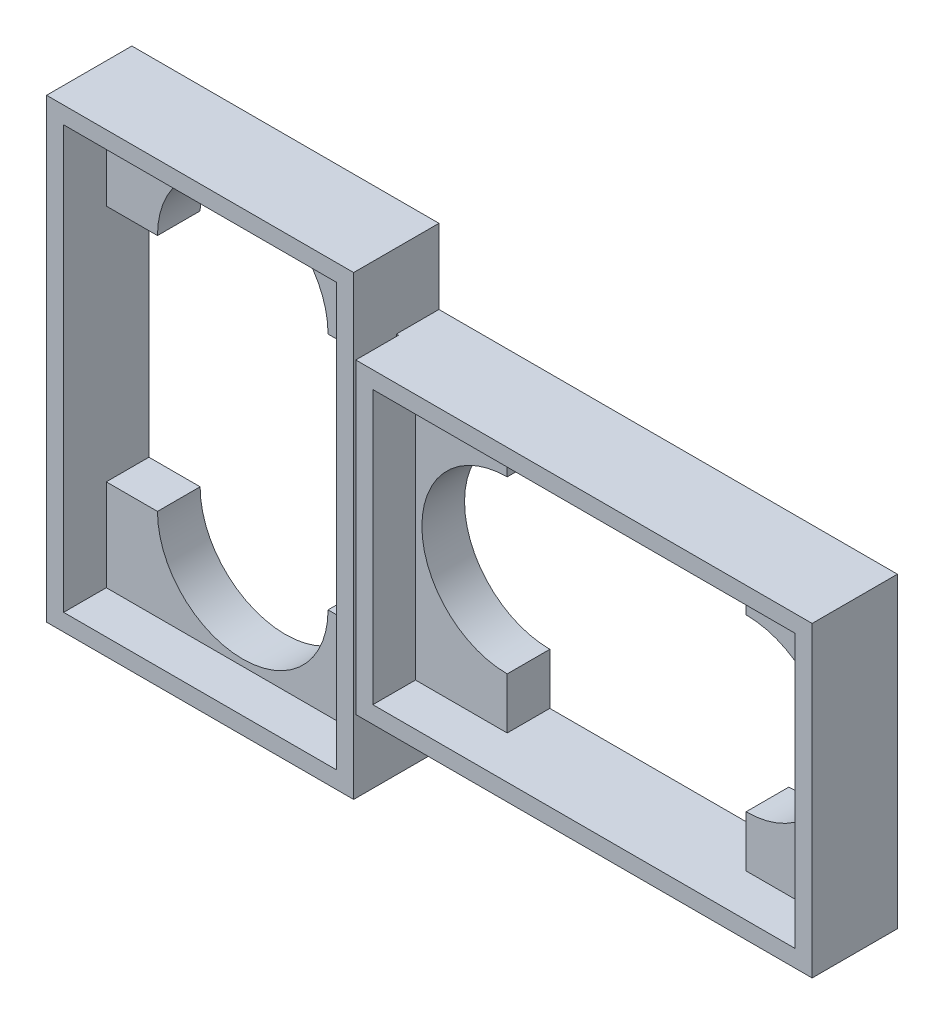
ISO-10303-21;
HEADER;
FILE_DESCRIPTION(('STEP AP214'),'2;1');
FILE_NAME('part.step','',(''),(''),'','','');
FILE_SCHEMA(('AUTOMOTIVE_DESIGN { 1 0 10303 214 1 1 1 1 }'));
ENDSEC;
DATA;
#1=APPLICATION_CONTEXT('core data for automotive mechanical design processes');
#2=APPLICATION_PROTOCOL_DEFINITION('international standard','automotive_design',2000,#1);
#3=PRODUCT_CONTEXT('',#1,'mechanical');
#4=PRODUCT('Part','Part','',(#3));
#5=PRODUCT_RELATED_PRODUCT_CATEGORY('part','',(#4));
#6=PRODUCT_DEFINITION_FORMATION('','',#4);
#7=PRODUCT_DEFINITION_CONTEXT('part definition',#1,'design');
#8=PRODUCT_DEFINITION('design','',#6,#7);
#9=PRODUCT_DEFINITION_SHAPE('','',#8);
#10=(LENGTH_UNIT() NAMED_UNIT(*) SI_UNIT(.MILLI.,.METRE.));
#11=(NAMED_UNIT(*) PLANE_ANGLE_UNIT() SI_UNIT($,.RADIAN.));
#12=(NAMED_UNIT(*) SI_UNIT($,.STERADIAN.) SOLID_ANGLE_UNIT());
#13=UNCERTAINTY_MEASURE_WITH_UNIT(LENGTH_MEASURE(1.E-05),#10,'distance_accuracy_value','');
#14=(GEOMETRIC_REPRESENTATION_CONTEXT(3) GLOBAL_UNCERTAINTY_ASSIGNED_CONTEXT((#13)) GLOBAL_UNIT_ASSIGNED_CONTEXT((#10,
#11,#12)) REPRESENTATION_CONTEXT('',''));
#15=CARTESIAN_POINT('',(0.,0.,0.));
#16=DIRECTION('',(0.,0.,1.));
#17=DIRECTION('',(1.,0.,0.));
#18=AXIS2_PLACEMENT_3D('',#15,#16,#17);
#19=CARTESIAN_POINT('',(0.,0.,5.));
#20=DIRECTION('',(0.,0.,-1.));
#21=DIRECTION('',(-1.,0.,0.));
#22=AXIS2_PLACEMENT_3D('',#19,#20,#21);
#23=PLANE('',#22);
#24=DIRECTION('',(0.,1.,0.));
#25=VECTOR('',#24,1.);
#26=CARTESIAN_POINT('',(-7.,0.,5.));
#27=LINE('',#26,#25);
#28=CARTESIAN_POINT('',(-7.,-15.1889938763432,5.));
#29=VERTEX_POINT('',#28);
#30=CARTESIAN_POINT('',(-7.,18.,5.));
#31=VERTEX_POINT('',#30);
#32=EDGE_CURVE('E636',#29,#31,#27,.T.);
#33=ORIENTED_EDGE('',*,*,#32,.F.);
#34=DIRECTION('',(-1.,0.,0.));
#35=VECTOR('',#34,1.);
#36=CARTESIAN_POINT('',(0.,-15.1889938763432,5.));
#37=LINE('',#36,#35);
#38=CARTESIAN_POINT('',(-6.75000000000001,-15.1889938763432,5.));
#39=VERTEX_POINT('',#38);
#40=EDGE_CURVE('E691',#39,#29,#37,.T.);
#41=ORIENTED_EDGE('',*,*,#40,.F.);
#42=DIRECTION('',(0.,1.,0.));
#43=VECTOR('',#42,1.);
#44=CARTESIAN_POINT('',(-6.75000000000001,0.,5.));
#45=LINE('',#44,#43);
#46=CARTESIAN_POINT('',(-6.75000000000001,18.,5.));
#47=VERTEX_POINT('',#46);
#48=EDGE_CURVE('E565',#39,#47,#45,.T.);
#49=ORIENTED_EDGE('',*,*,#48,.T.);
#50=DIRECTION('',(1.,0.,0.));
#51=VECTOR('',#50,1.);
#52=CARTESIAN_POINT('',(0.,18.,5.));
#53=LINE('',#52,#51);
#54=EDGE_CURVE('E708',#31,#47,#53,.T.);
#55=ORIENTED_EDGE('',*,*,#54,.F.);
#56=EDGE_LOOP('',(#33,#41,#49,#55));
#57=FACE_BOUND('',#56,.T.);
#58=ADVANCED_FACE('F87',(#57),#23,.F.);
#59=CARTESIAN_POINT('',(-25.,-14.,5.));
#60=DIRECTION('',(0.,0.,1.));
#61=DIRECTION('',(1.,0.,0.));
#62=AXIS2_PLACEMENT_3D('',#59,#60,#61);
#63=CIRCLE('',#62,10.);
#64=CARTESIAN_POINT('',(-15.,-14.,5.));
#65=VERTEX_POINT('',#64);
#66=CARTESIAN_POINT('',(-35.,-14.,5.));
#67=VERTEX_POINT('',#66);
#68=EDGE_CURVE('E487',#65,#67,#63,.F.);
#69=ORIENTED_EDGE('',*,*,#68,.T.);
#70=DIRECTION('',(1.,0.,0.));
#71=VECTOR('',#70,1.);
#72=CARTESIAN_POINT('',(-35.,-14.,5.));
#73=LINE('',#72,#71);
#74=CARTESIAN_POINT('',(-41.,-14.,5.));
#75=VERTEX_POINT('',#74);
#76=EDGE_CURVE('E402',#75,#67,#73,.T.);
#77=ORIENTED_EDGE('',*,*,#76,.F.);
#78=DIRECTION('',(0.,1.,0.));
#79=VECTOR('',#78,1.);
#80=CARTESIAN_POINT('',(-41.,0.,5.));
#81=LINE('',#80,#79);
#82=CARTESIAN_POINT('',(-41.,-24.75,5.));
#83=VERTEX_POINT('',#82);
#84=EDGE_CURVE('E620',#83,#75,#81,.T.);
#85=ORIENTED_EDGE('',*,*,#84,.F.);
#86=DIRECTION('',(-1.,0.,0.));
#87=VECTOR('',#86,1.);
#88=CARTESIAN_POINT('',(0.,-24.75,5.));
#89=LINE('',#88,#87);
#90=CARTESIAN_POINT('',(-9.,-24.75,5.));
#91=VERTEX_POINT('',#90);
#92=EDGE_CURVE('E592',#91,#83,#89,.T.);
#93=ORIENTED_EDGE('',*,*,#92,.F.);
#94=DIRECTION('',(0.,1.,0.));
#95=VECTOR('',#94,1.);
#96=CARTESIAN_POINT('',(-9.,0.,5.));
#97=LINE('',#96,#95);
#98=CARTESIAN_POINT('',(-9.,-14.,5.));
#99=VERTEX_POINT('',#98);
#100=EDGE_CURVE('E604',#91,#99,#97,.T.);
#101=ORIENTED_EDGE('',*,*,#100,.T.);
#102=DIRECTION('',(1.,0.,0.));
#103=VECTOR('',#102,1.);
#104=CARTESIAN_POINT('',(-15.,-14.,5.));
#105=LINE('',#104,#103);
#106=EDGE_CURVE('E421',#65,#99,#105,.T.);
#107=ORIENTED_EDGE('',*,*,#106,.F.);
#108=EDGE_LOOP('',(#69,#77,#85,#93,#101,#107));
#109=FACE_BOUND('',#108,.T.);
#110=ADVANCED_FACE('F741',(#109),#23,.F.);
#111=CARTESIAN_POINT('',(5.99999999999999,0.,5.));
#112=DIRECTION('',(0.,0.,1.));
#113=DIRECTION('',(1.,0.,0.));
#114=AXIS2_PLACEMENT_3D('',#111,#112,#113);
#115=CIRCLE('',#114,10.);
#116=CARTESIAN_POINT('',(6.00000000000009,-10.,5.));
#117=VERTEX_POINT('',#116);
#118=CARTESIAN_POINT('',(5.99999999999995,9.99999999999999,5.));
#119=VERTEX_POINT('',#118);
#120=EDGE_CURVE('E473',#117,#119,#115,.F.);
#121=ORIENTED_EDGE('',*,*,#120,.T.);
#122=DIRECTION('',(0.,-1.,0.));
#123=VECTOR('',#122,1.);
#124=CARTESIAN_POINT('',(5.99999999999995,9.99999999999999,5.));
#125=LINE('',#124,#123);
#126=CARTESIAN_POINT('',(5.99999999999999,16.,5.));
#127=VERTEX_POINT('',#126);
#128=EDGE_CURVE('E394',#127,#119,#125,.T.);
#129=ORIENTED_EDGE('',*,*,#128,.F.);
#130=DIRECTION('',(-1.,0.,0.));
#131=VECTOR('',#130,1.);
#132=CARTESIAN_POINT('',(0.,16.,5.));
#133=LINE('',#132,#131);
#134=CARTESIAN_POINT('',(-4.75000000000001,16.,5.));
#135=VERTEX_POINT('',#134);
#136=EDGE_CURVE('E548',#127,#135,#133,.T.);
#137=ORIENTED_EDGE('',*,*,#136,.T.);
#138=DIRECTION('',(0.,1.,0.));
#139=VECTOR('',#138,1.);
#140=CARTESIAN_POINT('',(-4.75000000000001,0.,5.));
#141=LINE('',#140,#139);
#142=CARTESIAN_POINT('',(-4.75000000000001,-16.,5.));
#143=VERTEX_POINT('',#142);
#144=EDGE_CURVE('E517',#143,#135,#141,.T.);
#145=ORIENTED_EDGE('',*,*,#144,.F.);
#146=DIRECTION('',(-1.,0.,0.));
#147=VECTOR('',#146,1.);
#148=CARTESIAN_POINT('',(0.,-16.,5.));
#149=LINE('',#148,#147);
#150=CARTESIAN_POINT('',(5.99999999999999,-16.,5.));
#151=VERTEX_POINT('',#150);
#152=EDGE_CURVE('E557',#151,#143,#149,.T.);
#153=ORIENTED_EDGE('',*,*,#152,.F.);
#154=DIRECTION('',(0.,-1.,0.));
#155=VECTOR('',#154,1.);
#156=CARTESIAN_POINT('',(6.00000000000009,-10.,5.));
#157=LINE('',#156,#155);
#158=EDGE_CURVE('E371',#117,#151,#157,.T.);
#159=ORIENTED_EDGE('',*,*,#158,.F.);
#160=EDGE_LOOP('',(#121,#129,#137,#145,#153,#159));
#161=FACE_BOUND('',#160,.T.);
#162=ADVANCED_FACE('F746',(#161),#23,.F.);
#163=CARTESIAN_POINT('',(0.,0.,0.));
#164=DIRECTION('',(0.,0.,-1.));
#165=DIRECTION('',(-1.,0.,0.));
#166=AXIS2_PLACEMENT_3D('',#163,#164,#165);
#167=PLANE('',#166);
#168=DIRECTION('',(0.,1.,0.));
#169=VECTOR('',#168,1.);
#170=CARTESIAN_POINT('',(46.75,0.,0.));
#171=LINE('',#170,#169);
#172=CARTESIAN_POINT('',(46.75,-18.,0.));
#173=VERTEX_POINT('',#172);
#174=CARTESIAN_POINT('',(46.75,18.,0.));
#175=VERTEX_POINT('',#174);
#176=EDGE_CURVE('E320',#173,#175,#171,.T.);
#177=ORIENTED_EDGE('',*,*,#176,.F.);
#178=DIRECTION('',(1.,0.,0.));
#179=VECTOR('',#178,1.);
#180=CARTESIAN_POINT('',(0.,-18.,0.));
#181=LINE('',#180,#179);
#182=CARTESIAN_POINT('',(-6.75000000000001,-18.,0.));
#183=VERTEX_POINT('',#182);
#184=EDGE_CURVE('E335',#183,#173,#181,.T.);
#185=ORIENTED_EDGE('',*,*,#184,.F.);
#186=DIRECTION('',(0.,-1.,0.));
#187=VECTOR('',#186,1.);
#188=CARTESIAN_POINT('',(-6.75000000000001,0.,0.));
#189=LINE('',#188,#187);
#190=CARTESIAN_POINT('',(-6.75000000000001,-15.1889938763432,0.));
#191=VERTEX_POINT('',#190);
#192=EDGE_CURVE('E343',#191,#183,#189,.T.);
#193=ORIENTED_EDGE('',*,*,#192,.F.);
#194=DIRECTION('',(1.,0.,0.));
#195=VECTOR('',#194,1.);
#196=CARTESIAN_POINT('',(0.,-15.1889938763432,0.));
#197=LINE('',#196,#195);
#198=CARTESIAN_POINT('',(-7.,-15.1889938763432,0.));
#199=VERTEX_POINT('',#198);
#200=EDGE_CURVE('E346',#199,#191,#197,.T.);
#201=ORIENTED_EDGE('',*,*,#200,.F.);
#202=DIRECTION('',(0.,1.,0.));
#203=VECTOR('',#202,1.);
#204=CARTESIAN_POINT('',(-7.,0.,0.));
#205=LINE('',#204,#203);
#206=CARTESIAN_POINT('',(-7.,-26.75,0.));
#207=VERTEX_POINT('',#206);
#208=EDGE_CURVE('E352',#207,#199,#205,.T.);
#209=ORIENTED_EDGE('',*,*,#208,.F.);
#210=DIRECTION('',(1.,0.,0.));
#211=VECTOR('',#210,1.);
#212=CARTESIAN_POINT('',(0.,-26.75,0.));
#213=LINE('',#212,#211);
#214=CARTESIAN_POINT('',(-43.,-26.75,0.));
#215=VERTEX_POINT('',#214);
#216=EDGE_CURVE('E355',#215,#207,#213,.T.);
#217=ORIENTED_EDGE('',*,*,#216,.F.);
#218=DIRECTION('',(0.,-1.,0.));
#219=VECTOR('',#218,1.);
#220=CARTESIAN_POINT('',(-43.,0.,0.));
#221=LINE('',#220,#219);
#222=CARTESIAN_POINT('',(-43.,26.75,0.));
#223=VERTEX_POINT('',#222);
#224=EDGE_CURVE('E359',#223,#215,#221,.T.);
#225=ORIENTED_EDGE('',*,*,#224,.F.);
#226=DIRECTION('',(-1.,0.,0.));
#227=VECTOR('',#226,1.);
#228=CARTESIAN_POINT('',(0.,26.75,0.));
#229=LINE('',#228,#227);
#230=CARTESIAN_POINT('',(-7.,26.75,0.));
#231=VERTEX_POINT('',#230);
#232=EDGE_CURVE('E363',#231,#223,#229,.T.);
#233=ORIENTED_EDGE('',*,*,#232,.F.);
#234=DIRECTION('',(0.,1.,0.));
#235=VECTOR('',#234,1.);
#236=CARTESIAN_POINT('',(-7.,0.,0.));
#237=LINE('',#236,#235);
#238=CARTESIAN_POINT('',(-7.,18.,0.));
#239=VERTEX_POINT('',#238);
#240=EDGE_CURVE('E367',#239,#231,#237,.T.);
#241=ORIENTED_EDGE('',*,*,#240,.F.);
#242=DIRECTION('',(-1.,0.,0.));
#243=VECTOR('',#242,1.);
#244=CARTESIAN_POINT('',(0.,18.,0.));
#245=LINE('',#244,#243);
#246=EDGE_CURVE('E337',#175,#239,#245,.T.);
#247=ORIENTED_EDGE('',*,*,#246,.F.);
#248=EDGE_LOOP('',(#177,#185,#193,#201,#209,#217,#225,#233,#241,#247));
#249=FACE_BOUND('',#248,.T.);
#250=DIRECTION('',(1.,0.,0.));
#251=VECTOR('',#250,1.);
#252=CARTESIAN_POINT('',(-35.,-14.,0.));
#253=LINE('',#252,#251);
#254=CARTESIAN_POINT('',(-41.,-14.,0.));
#255=VERTEX_POINT('',#254);
#256=CARTESIAN_POINT('',(-35.,-14.,0.));
#257=VERTEX_POINT('',#256);
#258=EDGE_CURVE('E406',#255,#257,#253,.T.);
#259=ORIENTED_EDGE('',*,*,#258,.T.);
#260=CARTESIAN_POINT('',(-25.,-14.,0.));
#261=DIRECTION('',(0.,0.,1.));
#262=DIRECTION('',(1.,0.,0.));
#263=AXIS2_PLACEMENT_3D('',#260,#261,#262);
#264=CIRCLE('',#263,10.);
#265=CARTESIAN_POINT('',(-15.,-14.,0.));
#266=VERTEX_POINT('',#265);
#267=EDGE_CURVE('E498',#266,#257,#264,.F.);
#268=ORIENTED_EDGE('',*,*,#267,.F.);
#269=DIRECTION('',(1.,0.,0.));
#270=VECTOR('',#269,1.);
#271=CARTESIAN_POINT('',(-15.,-14.,0.));
#272=LINE('',#271,#270);
#273=CARTESIAN_POINT('',(-9.,-14.,0.));
#274=VERTEX_POINT('',#273);
#275=EDGE_CURVE('E113',#266,#274,#272,.T.);
#276=ORIENTED_EDGE('',*,*,#275,.T.);
#277=DIRECTION('',(0.,1.,0.));
#278=VECTOR('',#277,1.);
#279=CARTESIAN_POINT('',(-9.,14.,0.));
#280=LINE('',#279,#278);
#281=CARTESIAN_POINT('',(-9.,14.,0.));
#282=VERTEX_POINT('',#281);
#283=EDGE_CURVE('E447',#274,#282,#280,.T.);
#284=ORIENTED_EDGE('',*,*,#283,.T.);
#285=DIRECTION('',(-1.,0.,0.));
#286=VECTOR('',#285,1.);
#287=CARTESIAN_POINT('',(-15.,14.,0.));
#288=LINE('',#287,#286);
#289=CARTESIAN_POINT('',(-15.,14.,0.));
#290=VERTEX_POINT('',#289);
#291=EDGE_CURVE('E452',#282,#290,#288,.T.);
#292=ORIENTED_EDGE('',*,*,#291,.T.);
#293=CARTESIAN_POINT('',(-25.,14.,0.));
#294=DIRECTION('',(0.,0.,1.));
#295=DIRECTION('',(1.,0.,0.));
#296=AXIS2_PLACEMENT_3D('',#293,#294,#295);
#297=CIRCLE('',#296,10.);
#298=CARTESIAN_POINT('',(-35.,14.,0.));
#299=VERTEX_POINT('',#298);
#300=EDGE_CURVE('E502',#299,#290,#297,.F.);
#301=ORIENTED_EDGE('',*,*,#300,.F.);
#302=DIRECTION('',(-1.,0.,0.));
#303=VECTOR('',#302,1.);
#304=CARTESIAN_POINT('',(-35.,14.,0.));
#305=LINE('',#304,#303);
#306=CARTESIAN_POINT('',(-41.,14.,0.));
#307=VERTEX_POINT('',#306);
#308=EDGE_CURVE('E397',#299,#307,#305,.T.);
#309=ORIENTED_EDGE('',*,*,#308,.T.);
#310=DIRECTION('',(0.,-1.,0.));
#311=VECTOR('',#310,1.);
#312=CARTESIAN_POINT('',(-41.,14.,0.));
#313=LINE('',#312,#311);
#314=EDGE_CURVE('E401',#307,#255,#313,.T.);
#315=ORIENTED_EDGE('',*,*,#314,.T.);
#316=EDGE_LOOP('',(#259,#268,#276,#284,#292,#301,#309,#315));
#317=FACE_BOUND('',#316,.T.);
#318=DIRECTION('',(0.,-1.,0.));
#319=VECTOR('',#318,1.);
#320=CARTESIAN_POINT('',(5.99999999999995,9.99999999999999,0.));
#321=LINE('',#320,#319);
#322=CARTESIAN_POINT('',(5.99999999999999,16.,0.));
#323=VERTEX_POINT('',#322);
#324=CARTESIAN_POINT('',(5.99999999999995,9.99999999999999,0.));
#325=VERTEX_POINT('',#324);
#326=EDGE_CURVE('E424',#323,#325,#321,.T.);
#327=ORIENTED_EDGE('',*,*,#326,.T.);
#328=CARTESIAN_POINT('',(5.99999999999999,0.,0.));
#329=DIRECTION('',(0.,0.,1.));
#330=DIRECTION('',(1.,0.,0.));
#331=AXIS2_PLACEMENT_3D('',#328,#329,#330);
#332=CIRCLE('',#331,10.);
#333=CARTESIAN_POINT('',(6.00000000000009,-10.,0.));
#334=VERTEX_POINT('',#333);
#335=EDGE_CURVE('E472',#334,#325,#332,.F.);
#336=ORIENTED_EDGE('',*,*,#335,.F.);
#337=DIRECTION('',(0.,-1.,0.));
#338=VECTOR('',#337,1.);
#339=CARTESIAN_POINT('',(6.00000000000009,-10.,0.));
#340=LINE('',#339,#338);
#341=CARTESIAN_POINT('',(5.99999999999999,-16.,0.));
#342=VERTEX_POINT('',#341);
#343=EDGE_CURVE('E372',#334,#342,#340,.T.);
#344=ORIENTED_EDGE('',*,*,#343,.T.);
#345=DIRECTION('',(1.,0.,0.));
#346=VECTOR('',#345,1.);
#347=CARTESIAN_POINT('',(5.99999999999999,-16.,0.));
#348=LINE('',#347,#346);
#349=CARTESIAN_POINT('',(34.,-16.,0.));
#350=VERTEX_POINT('',#349);
#351=EDGE_CURVE('E376',#342,#350,#348,.T.);
#352=ORIENTED_EDGE('',*,*,#351,.T.);
#353=DIRECTION('',(0.,1.,0.));
#354=VECTOR('',#353,1.);
#355=CARTESIAN_POINT('',(34.,-10.,0.));
#356=LINE('',#355,#354);
#357=CARTESIAN_POINT('',(34.,-10.,0.));
#358=VERTEX_POINT('',#357);
#359=EDGE_CURVE('E381',#350,#358,#356,.T.);
#360=ORIENTED_EDGE('',*,*,#359,.T.);
#361=CARTESIAN_POINT('',(34.,0.,0.));
#362=DIRECTION('',(0.,0.,1.));
#363=DIRECTION('',(1.,0.,0.));
#364=AXIS2_PLACEMENT_3D('',#361,#362,#363);
#365=CIRCLE('',#364,10.);
#366=CARTESIAN_POINT('',(34.,9.99999999999999,0.));
#367=VERTEX_POINT('',#366);
#368=EDGE_CURVE('E468',#358,#367,#365,.T.);
#369=ORIENTED_EDGE('',*,*,#368,.T.);
#370=DIRECTION('',(0.,1.,0.));
#371=VECTOR('',#370,1.);
#372=CARTESIAN_POINT('',(34.,9.99999999999999,0.));
#373=LINE('',#372,#371);
#374=CARTESIAN_POINT('',(34.,16.,0.));
#375=VERTEX_POINT('',#374);
#376=EDGE_CURVE('E105',#367,#375,#373,.T.);
#377=ORIENTED_EDGE('',*,*,#376,.T.);
#378=DIRECTION('',(-1.,0.,0.));
#379=VECTOR('',#378,1.);
#380=CARTESIAN_POINT('',(5.99999999999999,16.,0.));
#381=LINE('',#380,#379);
#382=EDGE_CURVE('E431',#375,#323,#381,.T.);
#383=ORIENTED_EDGE('',*,*,#382,.T.);
#384=EDGE_LOOP('',(#327,#336,#344,#352,#360,#369,#377,#383));
#385=FACE_BOUND('',#384,.T.);
#386=ADVANCED_FACE('F89',(#249,#317,#385),#167,.T.);
#387=CARTESIAN_POINT('',(0.,-26.75,10.));
#388=DIRECTION('',(0.,-1.,0.));
#389=DIRECTION('',(1.,0.,0.));
#390=AXIS2_PLACEMENT_3D('',#387,#388,#389);
#391=PLANE('',#390);
#392=DIRECTION('',(0.,0.,-1.));
#393=VECTOR('',#392,1.);
#394=CARTESIAN_POINT('',(-43.,-26.75,10.));
#395=LINE('',#394,#393);
#396=CARTESIAN_POINT('',(-43.,-26.75,10.));
#397=VERTEX_POINT('',#396);
#398=EDGE_CURVE('E91',#397,#215,#395,.T.);
#399=ORIENTED_EDGE('',*,*,#398,.T.);
#400=ORIENTED_EDGE('',*,*,#216,.T.);
#401=DIRECTION('',(0.,0.,-1.));
#402=VECTOR('',#401,1.);
#403=CARTESIAN_POINT('',(-7.,-26.75,10.));
#404=LINE('',#403,#402);
#405=CARTESIAN_POINT('',(-7.,-26.75,10.));
#406=VERTEX_POINT('',#405);
#407=EDGE_CURVE('E12',#406,#207,#404,.T.);
#408=ORIENTED_EDGE('',*,*,#407,.F.);
#409=DIRECTION('',(-1.,0.,0.));
#410=VECTOR('',#409,1.);
#411=CARTESIAN_POINT('',(0.,-26.75,10.));
#412=LINE('',#411,#410);
#413=EDGE_CURVE('E648',#406,#397,#412,.T.);
#414=ORIENTED_EDGE('',*,*,#413,.T.);
#415=EDGE_LOOP('',(#399,#400,#408,#414));
#416=FACE_BOUND('',#415,.T.);
#417=ADVANCED_FACE('F672',(#416),#391,.T.);
#418=CARTESIAN_POINT('',(-7.,0.,10.));
#419=DIRECTION('',(-1.,0.,0.));
#420=DIRECTION('',(0.,0.,1.));
#421=AXIS2_PLACEMENT_3D('',#418,#419,#420);
#422=PLANE('',#421);
#423=ORIENTED_EDGE('',*,*,#407,.T.);
#424=ORIENTED_EDGE('',*,*,#208,.T.);
#425=DIRECTION('',(0.,0.,1.));
#426=VECTOR('',#425,1.);
#427=CARTESIAN_POINT('',(-7.,-15.1889938763432,-5.));
#428=LINE('',#427,#426);
#429=EDGE_CURVE('E684',#199,#29,#428,.T.);
#430=ORIENTED_EDGE('',*,*,#429,.T.);
#431=ORIENTED_EDGE('',*,*,#32,.T.);
#432=DIRECTION('',(0.,0.,1.));
#433=VECTOR('',#432,1.);
#434=CARTESIAN_POINT('',(-7.,18.,-5.));
#435=LINE('',#434,#433);
#436=EDGE_CURVE('E698',#239,#31,#435,.T.);
#437=ORIENTED_EDGE('',*,*,#436,.F.);
#438=ORIENTED_EDGE('',*,*,#240,.T.);
#439=DIRECTION('',(0.,0.,-1.));
#440=VECTOR('',#439,1.);
#441=CARTESIAN_POINT('',(-7.,26.75,10.));
#442=LINE('',#441,#440);
#443=CARTESIAN_POINT('',(-7.,26.75,10.));
#444=VERTEX_POINT('',#443);
#445=EDGE_CURVE('E97',#444,#231,#442,.T.);
#446=ORIENTED_EDGE('',*,*,#445,.F.);
#447=DIRECTION('',(0.,1.,0.));
#448=VECTOR('',#447,1.);
#449=CARTESIAN_POINT('',(-7.,0.,10.));
#450=LINE('',#449,#448);
#451=EDGE_CURVE('E659',#406,#444,#450,.T.);
#452=ORIENTED_EDGE('',*,*,#451,.F.);
#453=EDGE_LOOP('',(#423,#424,#430,#431,#437,#438,#446,#452));
#454=FACE_BOUND('',#453,.T.);
#455=ADVANCED_FACE('F683',(#454),#422,.F.);
#456=CARTESIAN_POINT('',(0.,26.75,10.));
#457=DIRECTION('',(0.,-1.,0.));
#458=DIRECTION('',(1.,0.,0.));
#459=AXIS2_PLACEMENT_3D('',#456,#457,#458);
#460=PLANE('',#459);
#461=ORIENTED_EDGE('',*,*,#445,.T.);
#462=ORIENTED_EDGE('',*,*,#232,.T.);
#463=DIRECTION('',(0.,0.,-1.));
#464=VECTOR('',#463,1.);
#465=CARTESIAN_POINT('',(-43.,26.75,10.));
#466=LINE('',#465,#464);
#467=CARTESIAN_POINT('',(-43.,26.75,10.));
#468=VERTEX_POINT('',#467);
#469=EDGE_CURVE('E666',#468,#223,#466,.T.);
#470=ORIENTED_EDGE('',*,*,#469,.F.);
#471=DIRECTION('',(-1.,0.,0.));
#472=VECTOR('',#471,1.);
#473=CARTESIAN_POINT('',(0.,26.75,10.));
#474=LINE('',#473,#472);
#475=EDGE_CURVE('E656',#444,#468,#474,.T.);
#476=ORIENTED_EDGE('',*,*,#475,.F.);
#477=EDGE_LOOP('',(#461,#462,#470,#476));
#478=FACE_BOUND('',#477,.T.);
#479=ADVANCED_FACE('F722',(#478),#460,.F.);
#480=CARTESIAN_POINT('',(-43.,0.,10.));
#481=DIRECTION('',(-1.,0.,0.));
#482=DIRECTION('',(0.,0.,1.));
#483=AXIS2_PLACEMENT_3D('',#480,#481,#482);
#484=PLANE('',#483);
#485=ORIENTED_EDGE('',*,*,#469,.T.);
#486=ORIENTED_EDGE('',*,*,#224,.T.);
#487=ORIENTED_EDGE('',*,*,#398,.F.);
#488=DIRECTION('',(0.,1.,0.));
#489=VECTOR('',#488,1.);
#490=CARTESIAN_POINT('',(-43.,0.,10.));
#491=LINE('',#490,#489);
#492=EDGE_CURVE('E652',#397,#468,#491,.T.);
#493=ORIENTED_EDGE('',*,*,#492,.T.);
#494=EDGE_LOOP('',(#485,#486,#487,#493));
#495=FACE_BOUND('',#494,.T.);
#496=ADVANCED_FACE('F678',(#495),#484,.T.);
#497=CARTESIAN_POINT('',(0.,0.,10.));
#498=DIRECTION('',(0.,0.,-1.));
#499=DIRECTION('',(-1.,0.,0.));
#500=AXIS2_PLACEMENT_3D('',#497,#498,#499);
#501=PLANE('',#500);
#502=DIRECTION('',(0.,1.,0.));
#503=VECTOR('',#502,1.);
#504=CARTESIAN_POINT('',(-9.,0.,10.));
#505=LINE('',#504,#503);
#506=CARTESIAN_POINT('',(-9.,-24.75,10.));
#507=VERTEX_POINT('',#506);
#508=CARTESIAN_POINT('',(-9.,24.75,10.));
#509=VERTEX_POINT('',#508);
#510=EDGE_CURVE('E612',#507,#509,#505,.T.);
#511=ORIENTED_EDGE('',*,*,#510,.F.);
#512=DIRECTION('',(-1.,0.,0.));
#513=VECTOR('',#512,1.);
#514=CARTESIAN_POINT('',(0.,-24.75,10.));
#515=LINE('',#514,#513);
#516=CARTESIAN_POINT('',(-41.,-24.75,10.));
#517=VERTEX_POINT('',#516);
#518=EDGE_CURVE('E599',#507,#517,#515,.T.);
#519=ORIENTED_EDGE('',*,*,#518,.T.);
#520=DIRECTION('',(0.,1.,0.));
#521=VECTOR('',#520,1.);
#522=CARTESIAN_POINT('',(-41.,0.,10.));
#523=LINE('',#522,#521);
#524=CARTESIAN_POINT('',(-41.,24.75,10.));
#525=VERTEX_POINT('',#524);
#526=EDGE_CURVE('E603',#517,#525,#523,.T.);
#527=ORIENTED_EDGE('',*,*,#526,.T.);
#528=DIRECTION('',(-1.,0.,0.));
#529=VECTOR('',#528,1.);
#530=CARTESIAN_POINT('',(0.,24.75,10.));
#531=LINE('',#530,#529);
#532=EDGE_CURVE('E608',#509,#525,#531,.T.);
#533=ORIENTED_EDGE('',*,*,#532,.F.);
#534=EDGE_LOOP('',(#511,#519,#527,#533));
#535=FACE_BOUND('',#534,.T.);
#536=ORIENTED_EDGE('',*,*,#413,.F.);
#537=ORIENTED_EDGE('',*,*,#451,.T.);
#538=ORIENTED_EDGE('',*,*,#475,.T.);
#539=ORIENTED_EDGE('',*,*,#492,.F.);
#540=EDGE_LOOP('',(#536,#537,#538,#539));
#541=FACE_BOUND('',#540,.T.);
#542=ADVANCED_FACE('F725',(#535,#541),#501,.F.);
#543=CARTESIAN_POINT('',(0.,-24.75,10.));
#544=DIRECTION('',(0.,-1.,0.));
#545=DIRECTION('',(1.,0.,0.));
#546=AXIS2_PLACEMENT_3D('',#543,#544,#545);
#547=PLANE('',#546);
#548=ORIENTED_EDGE('',*,*,#92,.T.);
#549=DIRECTION('',(0.,0.,-1.));
#550=VECTOR('',#549,1.);
#551=CARTESIAN_POINT('',(-41.,-24.75,10.));
#552=LINE('',#551,#550);
#553=EDGE_CURVE('E615',#517,#83,#552,.T.);
#554=ORIENTED_EDGE('',*,*,#553,.F.);
#555=ORIENTED_EDGE('',*,*,#518,.F.);
#556=DIRECTION('',(0.,0.,-1.));
#557=VECTOR('',#556,1.);
#558=CARTESIAN_POINT('',(-9.,-24.75,10.));
#559=LINE('',#558,#557);
#560=EDGE_CURVE('E632',#507,#91,#559,.T.);
#561=ORIENTED_EDGE('',*,*,#560,.T.);
#562=EDGE_LOOP('',(#548,#554,#555,#561));
#563=FACE_BOUND('',#562,.T.);
#564=ADVANCED_FACE('F727',(#563),#547,.F.);
#565=CARTESIAN_POINT('',(-9.,0.,10.));
#566=DIRECTION('',(-1.,0.,0.));
#567=DIRECTION('',(0.,0.,1.));
#568=AXIS2_PLACEMENT_3D('',#565,#566,#567);
#569=PLANE('',#568);
#570=ORIENTED_EDGE('',*,*,#100,.F.);
#571=ORIENTED_EDGE('',*,*,#560,.F.);
#572=ORIENTED_EDGE('',*,*,#510,.T.);
#573=DIRECTION('',(0.,0.,-1.));
#574=VECTOR('',#573,1.);
#575=CARTESIAN_POINT('',(-9.,24.75,10.));
#576=LINE('',#575,#574);
#577=CARTESIAN_POINT('',(-9.,24.75,5.));
#578=VERTEX_POINT('',#577);
#579=EDGE_CURVE('E637',#509,#578,#576,.T.);
#580=ORIENTED_EDGE('',*,*,#579,.T.);
#581=CARTESIAN_POINT('',(-9.,14.,5.));
#582=VERTEX_POINT('',#581);
#583=EDGE_CURVE('E628',#582,#578,#97,.T.);
#584=ORIENTED_EDGE('',*,*,#583,.F.);
#585=DIRECTION('',(0.,0.,1.));
#586=VECTOR('',#585,1.);
#587=CARTESIAN_POINT('',(-9.,14.,0.));
#588=LINE('',#587,#586);
#589=EDGE_CURVE('E462',#282,#582,#588,.T.);
#590=ORIENTED_EDGE('',*,*,#589,.F.);
#591=ORIENTED_EDGE('',*,*,#283,.F.);
#592=DIRECTION('',(0.,0.,1.));
#593=VECTOR('',#592,1.);
#594=CARTESIAN_POINT('',(-9.,-14.,0.));
#595=LINE('',#594,#593);
#596=EDGE_CURVE('E456',#274,#99,#595,.T.);
#597=ORIENTED_EDGE('',*,*,#596,.T.);
#598=EDGE_LOOP('',(#570,#571,#572,#580,#584,#590,#591,#597));
#599=FACE_BOUND('',#598,.T.);
#600=ADVANCED_FACE('F734',(#599),#569,.T.);
#601=CARTESIAN_POINT('',(0.,24.75,10.));
#602=DIRECTION('',(0.,-1.,0.));
#603=DIRECTION('',(1.,0.,0.));
#604=AXIS2_PLACEMENT_3D('',#601,#602,#603);
#605=PLANE('',#604);
#606=DIRECTION('',(-1.,0.,0.));
#607=VECTOR('',#606,1.);
#608=CARTESIAN_POINT('',(0.,24.75,5.));
#609=LINE('',#608,#607);
#610=CARTESIAN_POINT('',(-41.,24.75,5.));
#611=VERTEX_POINT('',#610);
#612=EDGE_CURVE('E624',#578,#611,#609,.T.);
#613=ORIENTED_EDGE('',*,*,#612,.F.);
#614=ORIENTED_EDGE('',*,*,#579,.F.);
#615=ORIENTED_EDGE('',*,*,#532,.T.);
#616=DIRECTION('',(0.,0.,-1.));
#617=VECTOR('',#616,1.);
#618=CARTESIAN_POINT('',(-41.,24.75,10.));
#619=LINE('',#618,#617);
#620=EDGE_CURVE('E641',#525,#611,#619,.T.);
#621=ORIENTED_EDGE('',*,*,#620,.T.);
#622=EDGE_LOOP('',(#613,#614,#615,#621));
#623=FACE_BOUND('',#622,.T.);
#624=ADVANCED_FACE('F758',(#623),#605,.T.);
#625=CARTESIAN_POINT('',(-41.,0.,10.));
#626=DIRECTION('',(-1.,0.,0.));
#627=DIRECTION('',(0.,0.,1.));
#628=AXIS2_PLACEMENT_3D('',#625,#626,#627);
#629=PLANE('',#628);
#630=ORIENTED_EDGE('',*,*,#84,.T.);
#631=DIRECTION('',(0.,0.,1.));
#632=VECTOR('',#631,1.);
#633=CARTESIAN_POINT('',(-41.,-14.,0.));
#634=LINE('',#633,#632);
#635=EDGE_CURVE('E418',#255,#75,#634,.T.);
#636=ORIENTED_EDGE('',*,*,#635,.F.);
#637=ORIENTED_EDGE('',*,*,#314,.F.);
#638=DIRECTION('',(0.,0.,1.));
#639=VECTOR('',#638,1.);
#640=CARTESIAN_POINT('',(-41.,14.,0.));
#641=LINE('',#640,#639);
#642=CARTESIAN_POINT('',(-41.,14.,5.));
#643=VERTEX_POINT('',#642);
#644=EDGE_CURVE('E410',#307,#643,#641,.T.);
#645=ORIENTED_EDGE('',*,*,#644,.T.);
#646=EDGE_CURVE('E619',#643,#611,#81,.T.);
#647=ORIENTED_EDGE('',*,*,#646,.T.);
#648=ORIENTED_EDGE('',*,*,#620,.F.);
#649=ORIENTED_EDGE('',*,*,#526,.F.);
#650=ORIENTED_EDGE('',*,*,#553,.T.);
#651=EDGE_LOOP('',(#630,#636,#637,#645,#647,#648,#649,#650));
#652=FACE_BOUND('',#651,.T.);
#653=ADVANCED_FACE('F750',(#652),#629,.F.);
#654=ORIENTED_EDGE('',*,*,#646,.F.);
#655=DIRECTION('',(-1.,0.,0.));
#656=VECTOR('',#655,1.);
#657=CARTESIAN_POINT('',(-35.,14.,5.));
#658=LINE('',#657,#656);
#659=CARTESIAN_POINT('',(-35.,14.,5.));
#660=VERTEX_POINT('',#659);
#661=EDGE_CURVE('E411',#660,#643,#658,.T.);
#662=ORIENTED_EDGE('',*,*,#661,.F.);
#663=CARTESIAN_POINT('',(-25.,14.,5.));
#664=DIRECTION('',(0.,0.,1.));
#665=DIRECTION('',(1.,0.,0.));
#666=AXIS2_PLACEMENT_3D('',#663,#664,#665);
#667=CIRCLE('',#666,10.);
#668=CARTESIAN_POINT('',(-15.,14.,5.));
#669=VERTEX_POINT('',#668);
#670=EDGE_CURVE('E503',#660,#669,#667,.F.);
#671=ORIENTED_EDGE('',*,*,#670,.T.);
#672=DIRECTION('',(-1.,0.,0.));
#673=VECTOR('',#672,1.);
#674=CARTESIAN_POINT('',(-15.,14.,5.));
#675=LINE('',#674,#673);
#676=EDGE_CURVE('E448',#582,#669,#675,.T.);
#677=ORIENTED_EDGE('',*,*,#676,.F.);
#678=ORIENTED_EDGE('',*,*,#583,.T.);
#679=ORIENTED_EDGE('',*,*,#612,.T.);
#680=EDGE_LOOP('',(#654,#662,#671,#677,#678,#679));
#681=FACE_BOUND('',#680,.T.);
#682=ADVANCED_FACE('F742',(#681),#23,.F.);
#683=CARTESIAN_POINT('',(-6.75000000000001,0.,10.));
#684=DIRECTION('',(-1.,0.,0.));
#685=DIRECTION('',(0.,0.,1.));
#686=AXIS2_PLACEMENT_3D('',#683,#684,#685);
#687=PLANE('',#686);
#688=ORIENTED_EDGE('',*,*,#48,.F.);
#689=DIRECTION('',(0.,0.,1.));
#690=VECTOR('',#689,1.);
#691=CARTESIAN_POINT('',(-6.75000000000001,-15.1889938763432,-5.));
#692=LINE('',#691,#690);
#693=EDGE_CURVE('E694',#191,#39,#692,.T.);
#694=ORIENTED_EDGE('',*,*,#693,.F.);
#695=ORIENTED_EDGE('',*,*,#192,.T.);
#696=DIRECTION('',(0.,0.,-1.));
#697=VECTOR('',#696,1.);
#698=CARTESIAN_POINT('',(-6.75000000000001,-18.,10.));
#699=LINE('',#698,#697);
#700=CARTESIAN_POINT('',(-6.75000000000001,-18.,10.));
#701=VERTEX_POINT('',#700);
#702=EDGE_CURVE('E328',#701,#183,#699,.T.);
#703=ORIENTED_EDGE('',*,*,#702,.F.);
#704=DIRECTION('',(0.,1.,0.));
#705=VECTOR('',#704,1.);
#706=CARTESIAN_POINT('',(-6.75000000000001,0.,10.));
#707=LINE('',#706,#705);
#708=CARTESIAN_POINT('',(-6.75000000000001,18.,10.));
#709=VERTEX_POINT('',#708);
#710=EDGE_CURVE('E575',#701,#709,#707,.T.);
#711=ORIENTED_EDGE('',*,*,#710,.T.);
#712=DIRECTION('',(0.,0.,-1.));
#713=VECTOR('',#712,1.);
#714=CARTESIAN_POINT('',(-6.75000000000001,18.,10.));
#715=LINE('',#714,#713);
#716=EDGE_CURVE('E587',#709,#47,#715,.T.);
#717=ORIENTED_EDGE('',*,*,#716,.T.);
#718=EDGE_LOOP('',(#688,#694,#695,#703,#711,#717));
#719=FACE_BOUND('',#718,.T.);
#720=ADVANCED_FACE('F716',(#719),#687,.T.);
#721=CARTESIAN_POINT('',(0.,-18.,10.));
#722=DIRECTION('',(0.,-1.,0.));
#723=DIRECTION('',(1.,0.,0.));
#724=AXIS2_PLACEMENT_3D('',#721,#722,#723);
#725=PLANE('',#724);
#726=ORIENTED_EDGE('',*,*,#184,.T.);
#727=DIRECTION('',(0.,0.,-1.));
#728=VECTOR('',#727,1.);
#729=CARTESIAN_POINT('',(46.75,-18.,10.));
#730=LINE('',#729,#728);
#731=CARTESIAN_POINT('',(46.75,-18.,10.));
#732=VERTEX_POINT('',#731);
#733=EDGE_CURVE('E316',#732,#173,#730,.T.);
#734=ORIENTED_EDGE('',*,*,#733,.F.);
#735=DIRECTION('',(-1.,0.,0.));
#736=VECTOR('',#735,1.);
#737=CARTESIAN_POINT('',(0.,-18.,10.));
#738=LINE('',#737,#736);
#739=EDGE_CURVE('E584',#732,#701,#738,.T.);
#740=ORIENTED_EDGE('',*,*,#739,.T.);
#741=ORIENTED_EDGE('',*,*,#702,.T.);
#742=EDGE_LOOP('',(#726,#734,#740,#741));
#743=FACE_BOUND('',#742,.T.);
#744=ADVANCED_FACE('F340',(#743),#725,.T.);
#745=CARTESIAN_POINT('',(46.75,0.,10.));
#746=DIRECTION('',(-1.,0.,0.));
#747=DIRECTION('',(0.,-1.,0.));
#748=AXIS2_PLACEMENT_3D('',#745,#746,#747);
#749=PLANE('',#748);
#750=ORIENTED_EDGE('',*,*,#733,.T.);
#751=ORIENTED_EDGE('',*,*,#176,.T.);
#752=DIRECTION('',(0.,0.,-1.));
#753=VECTOR('',#752,1.);
#754=CARTESIAN_POINT('',(46.75,18.,10.));
#755=LINE('',#754,#753);
#756=CARTESIAN_POINT('',(46.75,18.,10.));
#757=VERTEX_POINT('',#756);
#758=EDGE_CURVE('E329',#757,#175,#755,.T.);
#759=ORIENTED_EDGE('',*,*,#758,.F.);
#760=DIRECTION('',(0.,1.,0.));
#761=VECTOR('',#760,1.);
#762=CARTESIAN_POINT('',(46.75,0.,10.));
#763=LINE('',#762,#761);
#764=EDGE_CURVE('E322',#732,#757,#763,.T.);
#765=ORIENTED_EDGE('',*,*,#764,.F.);
#766=EDGE_LOOP('',(#750,#751,#759,#765));
#767=FACE_BOUND('',#766,.T.);
#768=ADVANCED_FACE('F318',(#767),#749,.F.);
#769=CARTESIAN_POINT('',(0.,18.,10.));
#770=DIRECTION('',(0.,-1.,0.));
#771=DIRECTION('',(1.,0.,0.));
#772=AXIS2_PLACEMENT_3D('',#769,#770,#771);
#773=PLANE('',#772);
#774=ORIENTED_EDGE('',*,*,#758,.T.);
#775=ORIENTED_EDGE('',*,*,#246,.T.);
#776=ORIENTED_EDGE('',*,*,#436,.T.);
#777=ORIENTED_EDGE('',*,*,#54,.T.);
#778=ORIENTED_EDGE('',*,*,#716,.F.);
#779=DIRECTION('',(-1.,0.,0.));
#780=VECTOR('',#779,1.);
#781=CARTESIAN_POINT('',(0.,18.,10.));
#782=LINE('',#781,#780);
#783=EDGE_CURVE('E579',#757,#709,#782,.T.);
#784=ORIENTED_EDGE('',*,*,#783,.F.);
#785=EDGE_LOOP('',(#774,#775,#776,#777,#778,#784));
#786=FACE_BOUND('',#785,.T.);
#787=ADVANCED_FACE('F711',(#786),#773,.F.);
#788=CARTESIAN_POINT('',(0.,0.,10.));
#789=DIRECTION('',(0.,0.,1.));
#790=DIRECTION('',(1.,0.,0.));
#791=AXIS2_PLACEMENT_3D('',#788,#789,#790);
#792=PLANE('',#791);
#793=DIRECTION('',(0.,1.,0.));
#794=VECTOR('',#793,1.);
#795=CARTESIAN_POINT('',(-4.75000000000001,0.,10.));
#796=LINE('',#795,#794);
#797=CARTESIAN_POINT('',(-4.75000000000001,-16.,10.));
#798=VERTEX_POINT('',#797);
#799=CARTESIAN_POINT('',(-4.75000000000001,16.,10.));
#800=VERTEX_POINT('',#799);
#801=EDGE_CURVE('E528',#798,#800,#796,.T.);
#802=ORIENTED_EDGE('',*,*,#801,.T.);
#803=DIRECTION('',(-1.,0.,0.));
#804=VECTOR('',#803,1.);
#805=CARTESIAN_POINT('',(0.,16.,10.));
#806=LINE('',#805,#804);
#807=CARTESIAN_POINT('',(44.75,16.,10.));
#808=VERTEX_POINT('',#807);
#809=EDGE_CURVE('E532',#808,#800,#806,.T.);
#810=ORIENTED_EDGE('',*,*,#809,.F.);
#811=DIRECTION('',(0.,1.,0.));
#812=VECTOR('',#811,1.);
#813=CARTESIAN_POINT('',(44.75,0.,10.));
#814=LINE('',#813,#812);
#815=CARTESIAN_POINT('',(44.75,-16.,10.));
#816=VERTEX_POINT('',#815);
#817=EDGE_CURVE('E536',#816,#808,#814,.T.);
#818=ORIENTED_EDGE('',*,*,#817,.F.);
#819=DIRECTION('',(-1.,0.,0.));
#820=VECTOR('',#819,1.);
#821=CARTESIAN_POINT('',(0.,-16.,10.));
#822=LINE('',#821,#820);
#823=EDGE_CURVE('E540',#816,#798,#822,.T.);
#824=ORIENTED_EDGE('',*,*,#823,.T.);
#825=EDGE_LOOP('',(#802,#810,#818,#824));
#826=FACE_BOUND('',#825,.T.);
#827=ORIENTED_EDGE('',*,*,#710,.F.);
#828=ORIENTED_EDGE('',*,*,#739,.F.);
#829=ORIENTED_EDGE('',*,*,#764,.T.);
#830=ORIENTED_EDGE('',*,*,#783,.T.);
#831=EDGE_LOOP('',(#827,#828,#829,#830));
#832=FACE_BOUND('',#831,.T.);
#833=ADVANCED_FACE('F719',(#826,#832),#792,.T.);
#834=CARTESIAN_POINT('',(-4.75000000000001,0.,10.));
#835=DIRECTION('',(-1.,0.,0.));
#836=DIRECTION('',(0.,0.,1.));
#837=AXIS2_PLACEMENT_3D('',#834,#835,#836);
#838=PLANE('',#837);
#839=ORIENTED_EDGE('',*,*,#144,.T.);
#840=DIRECTION('',(0.,0.,-1.));
#841=VECTOR('',#840,1.);
#842=CARTESIAN_POINT('',(-4.75000000000001,16.,10.));
#843=LINE('',#842,#841);
#844=EDGE_CURVE('E544',#800,#135,#843,.T.);
#845=ORIENTED_EDGE('',*,*,#844,.F.);
#846=ORIENTED_EDGE('',*,*,#801,.F.);
#847=DIRECTION('',(0.,0.,-1.));
#848=VECTOR('',#847,1.);
#849=CARTESIAN_POINT('',(-4.75000000000001,-16.,10.));
#850=LINE('',#849,#848);
#851=EDGE_CURVE('E561',#798,#143,#850,.T.);
#852=ORIENTED_EDGE('',*,*,#851,.T.);
#853=EDGE_LOOP('',(#839,#845,#846,#852));
#854=FACE_BOUND('',#853,.T.);
#855=ADVANCED_FACE('F864',(#854),#838,.F.);
#856=CARTESIAN_POINT('',(0.,-16.,10.));
#857=DIRECTION('',(0.,-1.,0.));
#858=DIRECTION('',(1.,0.,0.));
#859=AXIS2_PLACEMENT_3D('',#856,#857,#858);
#860=PLANE('',#859);
#861=CARTESIAN_POINT('',(44.75,-16.,5.));
#862=VERTEX_POINT('',#861);
#863=CARTESIAN_POINT('',(34.,-16.,5.));
#864=VERTEX_POINT('',#863);
#865=EDGE_CURVE('E533',#862,#864,#149,.T.);
#866=ORIENTED_EDGE('',*,*,#865,.T.);
#867=DIRECTION('',(0.,0.,1.));
#868=VECTOR('',#867,1.);
#869=CARTESIAN_POINT('',(34.,-16.,0.));
#870=LINE('',#869,#868);
#871=EDGE_CURVE('E391',#350,#864,#870,.T.);
#872=ORIENTED_EDGE('',*,*,#871,.F.);
#873=ORIENTED_EDGE('',*,*,#351,.F.);
#874=DIRECTION('',(0.,0.,1.));
#875=VECTOR('',#874,1.);
#876=CARTESIAN_POINT('',(5.99999999999999,-16.,0.));
#877=LINE('',#876,#875);
#878=EDGE_CURVE('E385',#342,#151,#877,.T.);
#879=ORIENTED_EDGE('',*,*,#878,.T.);
#880=ORIENTED_EDGE('',*,*,#152,.T.);
#881=ORIENTED_EDGE('',*,*,#851,.F.);
#882=ORIENTED_EDGE('',*,*,#823,.F.);
#883=DIRECTION('',(0.,0.,-1.));
#884=VECTOR('',#883,1.);
#885=CARTESIAN_POINT('',(44.75,-16.,10.));
#886=LINE('',#885,#884);
#887=EDGE_CURVE('E566',#816,#862,#886,.T.);
#888=ORIENTED_EDGE('',*,*,#887,.T.);
#889=EDGE_LOOP('',(#866,#872,#873,#879,#880,#881,#882,#888));
#890=FACE_BOUND('',#889,.T.);
#891=ADVANCED_FACE('F861',(#890),#860,.F.);
#892=CARTESIAN_POINT('',(44.75,0.,10.));
#893=DIRECTION('',(-1.,0.,0.));
#894=DIRECTION('',(0.,-1.,0.));
#895=AXIS2_PLACEMENT_3D('',#892,#893,#894);
#896=PLANE('',#895);
#897=DIRECTION('',(0.,1.,0.));
#898=VECTOR('',#897,1.);
#899=CARTESIAN_POINT('',(44.75,0.,5.));
#900=LINE('',#899,#898);
#901=CARTESIAN_POINT('',(44.75,16.,5.));
#902=VERTEX_POINT('',#901);
#903=EDGE_CURVE('E553',#862,#902,#900,.T.);
#904=ORIENTED_EDGE('',*,*,#903,.F.);
#905=ORIENTED_EDGE('',*,*,#887,.F.);
#906=ORIENTED_EDGE('',*,*,#817,.T.);
#907=DIRECTION('',(0.,0.,-1.));
#908=VECTOR('',#907,1.);
#909=CARTESIAN_POINT('',(44.75,16.,10.));
#910=LINE('',#909,#908);
#911=EDGE_CURVE('E569',#808,#902,#910,.T.);
#912=ORIENTED_EDGE('',*,*,#911,.T.);
#913=EDGE_LOOP('',(#904,#905,#906,#912));
#914=FACE_BOUND('',#913,.T.);
#915=ADVANCED_FACE('F773',(#914),#896,.T.);
#916=CARTESIAN_POINT('',(0.,16.,10.));
#917=DIRECTION('',(0.,-1.,0.));
#918=DIRECTION('',(1.,0.,0.));
#919=AXIS2_PLACEMENT_3D('',#916,#917,#918);
#920=PLANE('',#919);
#921=CARTESIAN_POINT('',(34.,16.,5.));
#922=VERTEX_POINT('',#921);
#923=EDGE_CURVE('E549',#902,#922,#133,.T.);
#924=ORIENTED_EDGE('',*,*,#923,.F.);
#925=ORIENTED_EDGE('',*,*,#911,.F.);
#926=ORIENTED_EDGE('',*,*,#809,.T.);
#927=ORIENTED_EDGE('',*,*,#844,.T.);
#928=ORIENTED_EDGE('',*,*,#136,.F.);
#929=DIRECTION('',(0.,0.,1.));
#930=VECTOR('',#929,1.);
#931=CARTESIAN_POINT('',(5.99999999999999,16.,0.));
#932=LINE('',#931,#930);
#933=EDGE_CURVE('E415',#323,#127,#932,.T.);
#934=ORIENTED_EDGE('',*,*,#933,.F.);
#935=ORIENTED_EDGE('',*,*,#382,.F.);
#936=DIRECTION('',(0.,0.,1.));
#937=VECTOR('',#936,1.);
#938=CARTESIAN_POINT('',(34.,16.,0.));
#939=LINE('',#938,#937);
#940=EDGE_CURVE('E435',#375,#922,#939,.T.);
#941=ORIENTED_EDGE('',*,*,#940,.T.);
#942=EDGE_LOOP('',(#924,#925,#926,#927,#928,#934,#935,#941));
#943=FACE_BOUND('',#942,.T.);
#944=ADVANCED_FACE('F764',(#943),#920,.T.);
#945=ORIENTED_EDGE('',*,*,#923,.T.);
#946=DIRECTION('',(0.,1.,0.));
#947=VECTOR('',#946,1.);
#948=CARTESIAN_POINT('',(34.,9.99999999999999,5.));
#949=LINE('',#948,#947);
#950=CARTESIAN_POINT('',(34.,9.99999999999999,5.));
#951=VERTEX_POINT('',#950);
#952=EDGE_CURVE('E428',#951,#922,#949,.T.);
#953=ORIENTED_EDGE('',*,*,#952,.F.);
#954=CARTESIAN_POINT('',(34.,0.,5.));
#955=DIRECTION('',(0.,0.,1.));
#956=DIRECTION('',(1.,0.,0.));
#957=AXIS2_PLACEMENT_3D('',#954,#955,#956);
#958=CIRCLE('',#957,10.);
#959=CARTESIAN_POINT('',(34.,-10.,5.));
#960=VERTEX_POINT('',#959);
#961=EDGE_CURVE('E465',#960,#951,#958,.T.);
#962=ORIENTED_EDGE('',*,*,#961,.F.);
#963=DIRECTION('',(0.,1.,0.));
#964=VECTOR('',#963,1.);
#965=CARTESIAN_POINT('',(34.,-10.,5.));
#966=LINE('',#965,#964);
#967=EDGE_CURVE('E377',#864,#960,#966,.T.);
#968=ORIENTED_EDGE('',*,*,#967,.F.);
#969=ORIENTED_EDGE('',*,*,#865,.F.);
#970=ORIENTED_EDGE('',*,*,#903,.T.);
#971=EDGE_LOOP('',(#945,#953,#962,#968,#969,#970));
#972=FACE_BOUND('',#971,.T.);
#973=ADVANCED_FACE('F752',(#972),#23,.F.);
#974=CARTESIAN_POINT('',(-25.,14.,0.));
#975=DIRECTION('',(0.,0.,1.));
#976=DIRECTION('',(1.,0.,0.));
#977=AXIS2_PLACEMENT_3D('',#974,#975,#976);
#978=CYLINDRICAL_SURFACE('',#977,10.);
#979=ORIENTED_EDGE('',*,*,#670,.F.);
#980=DIRECTION('',(0.,0.,1.));
#981=VECTOR('',#980,1.);
#982=CARTESIAN_POINT('',(-35.,14.,0.));
#983=LINE('',#982,#981);
#984=EDGE_CURVE('E514',#299,#660,#983,.T.);
#985=ORIENTED_EDGE('',*,*,#984,.F.);
#986=ORIENTED_EDGE('',*,*,#300,.T.);
#987=DIRECTION('',(0.,0.,1.));
#988=VECTOR('',#987,1.);
#989=CARTESIAN_POINT('',(-15.,14.,0.));
#990=LINE('',#989,#988);
#991=EDGE_CURVE('E518',#290,#669,#990,.T.);
#992=ORIENTED_EDGE('',*,*,#991,.T.);
#993=EDGE_LOOP('',(#979,#985,#986,#992));
#994=FACE_BOUND('',#993,.T.);
#995=ADVANCED_FACE('F763',(#994),#978,.F.);
#996=CARTESIAN_POINT('',(-25.,-14.,0.));
#997=DIRECTION('',(0.,0.,1.));
#998=DIRECTION('',(1.,0.,0.));
#999=AXIS2_PLACEMENT_3D('',#996,#997,#998);
#1000=CYLINDRICAL_SURFACE('',#999,10.);
#1001=ORIENTED_EDGE('',*,*,#68,.F.);
#1002=DIRECTION('',(0.,0.,1.));
#1003=VECTOR('',#1002,1.);
#1004=CARTESIAN_POINT('',(-15.,-14.,0.));
#1005=LINE('',#1004,#1003);
#1006=EDGE_CURVE('E522',#266,#65,#1005,.T.);
#1007=ORIENTED_EDGE('',*,*,#1006,.F.);
#1008=ORIENTED_EDGE('',*,*,#267,.T.);
#1009=DIRECTION('',(0.,0.,1.));
#1010=VECTOR('',#1009,1.);
#1011=CARTESIAN_POINT('',(-35.,-14.,0.));
#1012=LINE('',#1011,#1010);
#1013=EDGE_CURVE('E507',#257,#67,#1012,.T.);
#1014=ORIENTED_EDGE('',*,*,#1013,.T.);
#1015=EDGE_LOOP('',(#1001,#1007,#1008,#1014));
#1016=FACE_BOUND('',#1015,.T.);
#1017=ADVANCED_FACE('F770',(#1016),#1000,.F.);
#1018=CARTESIAN_POINT('',(5.99999999999999,0.,0.));
#1019=DIRECTION('',(0.,0.,1.));
#1020=DIRECTION('',(1.,0.,0.));
#1021=AXIS2_PLACEMENT_3D('',#1018,#1019,#1020);
#1022=CYLINDRICAL_SURFACE('',#1021,10.);
#1023=ORIENTED_EDGE('',*,*,#120,.F.);
#1024=DIRECTION('',(0.,0.,1.));
#1025=VECTOR('',#1024,1.);
#1026=CARTESIAN_POINT('',(5.99999999999999,-10.,0.));
#1027=LINE('',#1026,#1025);
#1028=EDGE_CURVE('E484',#334,#117,#1027,.T.);
#1029=ORIENTED_EDGE('',*,*,#1028,.F.);
#1030=ORIENTED_EDGE('',*,*,#335,.T.);
#1031=DIRECTION('',(0.,0.,1.));
#1032=VECTOR('',#1031,1.);
#1033=CARTESIAN_POINT('',(5.99999999999999,9.99999999999999,0.));
#1034=LINE('',#1033,#1032);
#1035=EDGE_CURVE('E488',#325,#119,#1034,.T.);
#1036=ORIENTED_EDGE('',*,*,#1035,.T.);
#1037=EDGE_LOOP('',(#1023,#1029,#1030,#1036));
#1038=FACE_BOUND('',#1037,.T.);
#1039=ADVANCED_FACE('F788',(#1038),#1022,.F.);
#1040=CARTESIAN_POINT('',(34.,0.,0.));
#1041=DIRECTION('',(0.,0.,1.));
#1042=DIRECTION('',(1.,0.,0.));
#1043=AXIS2_PLACEMENT_3D('',#1040,#1041,#1042);
#1044=CYLINDRICAL_SURFACE('',#1043,10.);
#1045=ORIENTED_EDGE('',*,*,#961,.T.);
#1046=DIRECTION('',(0.,0.,1.));
#1047=VECTOR('',#1046,1.);
#1048=CARTESIAN_POINT('',(34.,9.99999999999999,0.));
#1049=LINE('',#1048,#1047);
#1050=EDGE_CURVE('E492',#367,#951,#1049,.T.);
#1051=ORIENTED_EDGE('',*,*,#1050,.F.);
#1052=ORIENTED_EDGE('',*,*,#368,.F.);
#1053=DIRECTION('',(0.,0.,1.));
#1054=VECTOR('',#1053,1.);
#1055=CARTESIAN_POINT('',(34.,-10.,0.));
#1056=LINE('',#1055,#1054);
#1057=EDGE_CURVE('E477',#358,#960,#1056,.T.);
#1058=ORIENTED_EDGE('',*,*,#1057,.T.);
#1059=EDGE_LOOP('',(#1045,#1051,#1052,#1058));
#1060=FACE_BOUND('',#1059,.T.);
#1061=ADVANCED_FACE('F853',(#1060),#1044,.F.);
#1062=CARTESIAN_POINT('',(6.00000000000009,-10.,0.));
#1063=DIRECTION('',(-1.,0.,0.));
#1064=DIRECTION('',(0.,-1.,0.));
#1065=AXIS2_PLACEMENT_3D('',#1062,#1063,#1064);
#1066=PLANE('',#1065);
#1067=ORIENTED_EDGE('',*,*,#158,.T.);
#1068=ORIENTED_EDGE('',*,*,#878,.F.);
#1069=ORIENTED_EDGE('',*,*,#343,.F.);
#1070=ORIENTED_EDGE('',*,*,#1028,.T.);
#1071=EDGE_LOOP('',(#1067,#1068,#1069,#1070));
#1072=FACE_BOUND('',#1071,.T.);
#1073=ADVANCED_FACE('F855',(#1072),#1066,.F.);
#1074=CARTESIAN_POINT('',(34.,-10.,0.));
#1075=DIRECTION('',(1.,0.,0.));
#1076=DIRECTION('',(0.,0.,-1.));
#1077=AXIS2_PLACEMENT_3D('',#1074,#1075,#1076);
#1078=PLANE('',#1077);
#1079=ORIENTED_EDGE('',*,*,#967,.T.);
#1080=ORIENTED_EDGE('',*,*,#1057,.F.);
#1081=ORIENTED_EDGE('',*,*,#359,.F.);
#1082=ORIENTED_EDGE('',*,*,#871,.T.);
#1083=EDGE_LOOP('',(#1079,#1080,#1081,#1082));
#1084=FACE_BOUND('',#1083,.T.);
#1085=ADVANCED_FACE('F846',(#1084),#1078,.F.);
#1086=CARTESIAN_POINT('',(5.99999999999995,9.99999999999999,0.));
#1087=DIRECTION('',(-1.,0.,0.));
#1088=DIRECTION('',(0.,-1.,0.));
#1089=AXIS2_PLACEMENT_3D('',#1086,#1087,#1088);
#1090=PLANE('',#1089);
#1091=ORIENTED_EDGE('',*,*,#128,.T.);
#1092=ORIENTED_EDGE('',*,*,#1035,.F.);
#1093=ORIENTED_EDGE('',*,*,#326,.F.);
#1094=ORIENTED_EDGE('',*,*,#933,.T.);
#1095=EDGE_LOOP('',(#1091,#1092,#1093,#1094));
#1096=FACE_BOUND('',#1095,.T.);
#1097=ADVANCED_FACE('F792',(#1096),#1090,.F.);
#1098=CARTESIAN_POINT('',(34.,9.99999999999999,0.));
#1099=DIRECTION('',(1.,0.,0.));
#1100=DIRECTION('',(0.,0.,-1.));
#1101=AXIS2_PLACEMENT_3D('',#1098,#1099,#1100);
#1102=PLANE('',#1101);
#1103=ORIENTED_EDGE('',*,*,#952,.T.);
#1104=ORIENTED_EDGE('',*,*,#940,.F.);
#1105=ORIENTED_EDGE('',*,*,#376,.F.);
#1106=ORIENTED_EDGE('',*,*,#1050,.T.);
#1107=EDGE_LOOP('',(#1103,#1104,#1105,#1106));
#1108=FACE_BOUND('',#1107,.T.);
#1109=ADVANCED_FACE('F841',(#1108),#1102,.F.);
#1110=CARTESIAN_POINT('',(-15.,14.,0.));
#1111=DIRECTION('',(0.,1.,0.));
#1112=DIRECTION('',(0.,0.,1.));
#1113=AXIS2_PLACEMENT_3D('',#1110,#1111,#1112);
#1114=PLANE('',#1113);
#1115=ORIENTED_EDGE('',*,*,#676,.T.);
#1116=ORIENTED_EDGE('',*,*,#991,.F.);
#1117=ORIENTED_EDGE('',*,*,#291,.F.);
#1118=ORIENTED_EDGE('',*,*,#589,.T.);
#1119=EDGE_LOOP('',(#1115,#1116,#1117,#1118));
#1120=FACE_BOUND('',#1119,.T.);
#1121=ADVANCED_FACE('F819',(#1120),#1114,.F.);
#1122=CARTESIAN_POINT('',(-15.,-14.,0.));
#1123=DIRECTION('',(0.,-1.,0.));
#1124=DIRECTION('',(0.,0.,-1.));
#1125=AXIS2_PLACEMENT_3D('',#1122,#1123,#1124);
#1126=PLANE('',#1125);
#1127=ORIENTED_EDGE('',*,*,#106,.T.);
#1128=ORIENTED_EDGE('',*,*,#596,.F.);
#1129=ORIENTED_EDGE('',*,*,#275,.F.);
#1130=ORIENTED_EDGE('',*,*,#1006,.T.);
#1131=EDGE_LOOP('',(#1127,#1128,#1129,#1130));
#1132=FACE_BOUND('',#1131,.T.);
#1133=ADVANCED_FACE('F823',(#1132),#1126,.F.);
#1134=CARTESIAN_POINT('',(-35.,-14.,0.));
#1135=DIRECTION('',(0.,-1.,0.));
#1136=DIRECTION('',(0.,0.,-1.));
#1137=AXIS2_PLACEMENT_3D('',#1134,#1135,#1136);
#1138=PLANE('',#1137);
#1139=ORIENTED_EDGE('',*,*,#76,.T.);
#1140=ORIENTED_EDGE('',*,*,#1013,.F.);
#1141=ORIENTED_EDGE('',*,*,#258,.F.);
#1142=ORIENTED_EDGE('',*,*,#635,.T.);
#1143=EDGE_LOOP('',(#1139,#1140,#1141,#1142));
#1144=FACE_BOUND('',#1143,.T.);
#1145=ADVANCED_FACE('F829',(#1144),#1138,.F.);
#1146=CARTESIAN_POINT('',(-35.,14.,0.));
#1147=DIRECTION('',(0.,1.,0.));
#1148=DIRECTION('',(0.,0.,1.));
#1149=AXIS2_PLACEMENT_3D('',#1146,#1147,#1148);
#1150=PLANE('',#1149);
#1151=ORIENTED_EDGE('',*,*,#661,.T.);
#1152=ORIENTED_EDGE('',*,*,#644,.F.);
#1153=ORIENTED_EDGE('',*,*,#308,.F.);
#1154=ORIENTED_EDGE('',*,*,#984,.T.);
#1155=EDGE_LOOP('',(#1151,#1152,#1153,#1154));
#1156=FACE_BOUND('',#1155,.T.);
#1157=ADVANCED_FACE('F830',(#1156),#1150,.F.);
#1158=CARTESIAN_POINT('',(0.,-15.1889938763432,-5.));
#1159=DIRECTION('',(0.,1.,0.));
#1160=DIRECTION('',(0.,0.,1.));
#1161=AXIS2_PLACEMENT_3D('',#1158,#1159,#1160);
#1162=PLANE('',#1161);
#1163=ORIENTED_EDGE('',*,*,#200,.T.);
#1164=ORIENTED_EDGE('',*,*,#693,.T.);
#1165=ORIENTED_EDGE('',*,*,#40,.T.);
#1166=ORIENTED_EDGE('',*,*,#429,.F.);
#1167=EDGE_LOOP('',(#1163,#1164,#1165,#1166));
#1168=FACE_BOUND('',#1167,.T.);
#1169=ADVANCED_FACE('F688',(#1168),#1162,.F.);
#1170=CLOSED_SHELL('',(#58,#110,#162,#386,#417,#455,#479,#496,#542,#564,#600,#624,#653,#682,
#720,#744,#768,#787,#833,#855,#891,#915,#944,#973,#995,#1017,#1039,#1061,#1073,#1085,#1097,
#1109,#1121,#1133,#1145,#1157,#1169));
#1171=MANIFOLD_SOLID_BREP('B2',#1170);
#1172=ADVANCED_BREP_SHAPE_REPRESENTATION('',(#18,#1171),#14);
#1173=SHAPE_DEFINITION_REPRESENTATION(#9,#1172);
ENDSEC;
END-ISO-10303-21;
